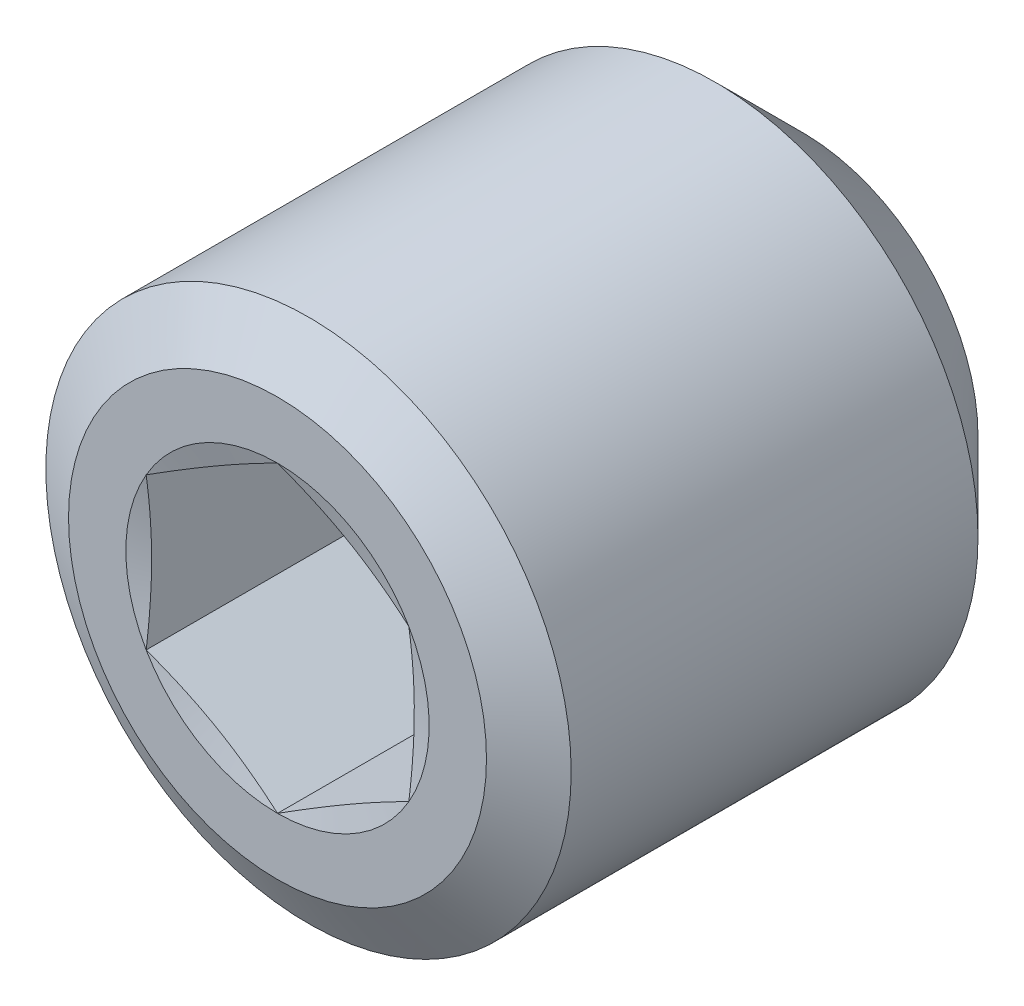
ISO-10303-21;
HEADER;
FILE_DESCRIPTION(('STEP AP214'),'2;1');
FILE_NAME('part.step','',(''),(''),'','','');
FILE_SCHEMA(('AUTOMOTIVE_DESIGN { 1 0 10303 214 1 1 1 1 }'));
ENDSEC;
DATA;
#1=APPLICATION_CONTEXT('core data for automotive mechanical design processes');
#2=APPLICATION_PROTOCOL_DEFINITION('international standard','automotive_design',2000,#1);
#3=PRODUCT_CONTEXT('',#1,'mechanical');
#4=PRODUCT('Part','Part','',(#3));
#5=PRODUCT_RELATED_PRODUCT_CATEGORY('part','',(#4));
#6=PRODUCT_DEFINITION_FORMATION('','',#4);
#7=PRODUCT_DEFINITION_CONTEXT('part definition',#1,'design');
#8=PRODUCT_DEFINITION('design','',#6,#7);
#9=PRODUCT_DEFINITION_SHAPE('','',#8);
#10=(LENGTH_UNIT() NAMED_UNIT(*) SI_UNIT(.MILLI.,.METRE.));
#11=(NAMED_UNIT(*) PLANE_ANGLE_UNIT() SI_UNIT($,.RADIAN.));
#12=(NAMED_UNIT(*) SI_UNIT($,.STERADIAN.) SOLID_ANGLE_UNIT());
#13=UNCERTAINTY_MEASURE_WITH_UNIT(LENGTH_MEASURE(1.E-05),#10,'distance_accuracy_value','');
#14=(GEOMETRIC_REPRESENTATION_CONTEXT(3) GLOBAL_UNCERTAINTY_ASSIGNED_CONTEXT((#13)) GLOBAL_UNIT_ASSIGNED_CONTEXT((#10,
#11,#12)) REPRESENTATION_CONTEXT('',''));
#15=CARTESIAN_POINT('',(0.,0.,0.));
#16=DIRECTION('',(0.,0.,1.));
#17=DIRECTION('',(1.,0.,0.));
#18=AXIS2_PLACEMENT_3D('',#15,#16,#17);
#19=CARTESIAN_POINT('',(0.,0.75,0.));
#20=DIRECTION('',(0.,0.,-1.));
#21=DIRECTION('',(-1.,0.,0.));
#22=AXIS2_PLACEMENT_3D('',#19,#20,#21);
#23=PLANE('',#22);
#24=CARTESIAN_POINT('',(0.,0.,0.));
#25=DIRECTION('',(0.,0.,1.));
#26=DIRECTION('',(1.,0.,0.));
#27=AXIS2_PLACEMENT_3D('',#24,#25,#26);
#28=CIRCLE('',#27,0.866025403784439);
#29=CARTESIAN_POINT('',(-0.75,-0.43301270189222,0.));
#30=VERTEX_POINT('',#29);
#31=CARTESIAN_POINT('',(0.,-0.866025403784439,0.));
#32=VERTEX_POINT('',#31);
#33=EDGE_CURVE('E168',#30,#32,#28,.T.);
#34=ORIENTED_EDGE('',*,*,#33,.F.);
#35=CARTESIAN_POINT('',(-0.75,0.433012701892219,0.));
#36=VERTEX_POINT('',#35);
#37=EDGE_CURVE('E167',#36,#30,#28,.T.);
#38=ORIENTED_EDGE('',*,*,#37,.F.);
#39=CARTESIAN_POINT('',(0.,0.866025403784439,0.));
#40=VERTEX_POINT('',#39);
#41=EDGE_CURVE('E133',#40,#36,#28,.T.);
#42=ORIENTED_EDGE('',*,*,#41,.F.);
#43=CARTESIAN_POINT('',(0.75,0.433012701892221,0.));
#44=VERTEX_POINT('',#43);
#45=EDGE_CURVE('E127',#44,#40,#28,.T.);
#46=ORIENTED_EDGE('',*,*,#45,.F.);
#47=CARTESIAN_POINT('',(0.75,-0.43301270189222,0.));
#48=VERTEX_POINT('',#47);
#49=EDGE_CURVE('E135',#48,#44,#28,.T.);
#50=ORIENTED_EDGE('',*,*,#49,.F.);
#51=EDGE_CURVE('E352',#32,#48,#28,.T.);
#52=ORIENTED_EDGE('',*,*,#51,.F.);
#53=EDGE_LOOP('',(#34,#38,#42,#46,#50,#52));
#54=FACE_BOUND('',#53,.T.);
#55=CARTESIAN_POINT('',(0.,0.,0.));
#56=DIRECTION('',(0.,0.,1.));
#57=DIRECTION('',(1.,0.,0.));
#58=AXIS2_PLACEMENT_3D('',#55,#56,#57);
#59=CIRCLE('',#58,1.1933);
#60=CARTESIAN_POINT('',(1.1933,0.,0.));
#61=VERTEX_POINT('',#60);
#62=EDGE_CURVE('E63',#61,#61,#59,.T.);
#63=ORIENTED_EDGE('',*,*,#62,.T.);
#64=EDGE_LOOP('',(#63));
#65=FACE_BOUND('',#64,.T.);
#66=ADVANCED_FACE('F50',(#54,#65),#23,.F.);
#67=CARTESIAN_POINT('',(0.,0.,-0.177073327560457));
#68=DIRECTION('',(0.,0.,-1.));
#69=DIRECTION('',(-1.,0.,0.));
#70=AXIS2_PLACEMENT_3D('',#67,#68,#69);
#71=CONICAL_SURFACE('',#70,1.5,1.0471975511966);
#72=ORIENTED_EDGE('',*,*,#62,.F.);
#73=EDGE_LOOP('',(#72));
#74=FACE_BOUND('',#73,.T.);
#75=CARTESIAN_POINT('',(0.,0.,-0.177073327560457));
#76=DIRECTION('',(0.,0.,1.));
#77=DIRECTION('',(1.,0.,0.));
#78=AXIS2_PLACEMENT_3D('',#75,#76,#77);
#79=CIRCLE('',#78,1.5);
#80=CARTESIAN_POINT('',(1.5,0.,-0.177073327560457));
#81=VERTEX_POINT('',#80);
#82=EDGE_CURVE('E316',#81,#81,#79,.T.);
#83=ORIENTED_EDGE('',*,*,#82,.T.);
#84=EDGE_LOOP('',(#83));
#85=FACE_BOUND('',#84,.T.);
#86=ADVANCED_FACE('F232',(#74,#85),#71,.T.);
#87=CARTESIAN_POINT('',(0.,0.,0.));
#88=DIRECTION('',(0.,0.,1.));
#89=DIRECTION('',(1.,0.,0.));
#90=AXIS2_PLACEMENT_3D('',#87,#88,#89);
#91=CYLINDRICAL_SURFACE('',#90,1.5);
#92=ORIENTED_EDGE('',*,*,#82,.F.);
#93=EDGE_LOOP('',(#92));
#94=FACE_BOUND('',#93,.T.);
#95=CARTESIAN_POINT('',(0.,0.,-2.5));
#96=DIRECTION('',(0.,0.,1.));
#97=DIRECTION('',(1.,0.,0.));
#98=AXIS2_PLACEMENT_3D('',#95,#96,#97);
#99=CIRCLE('',#98,1.5);
#100=CARTESIAN_POINT('',(1.5,0.,-2.5));
#101=VERTEX_POINT('',#100);
#102=EDGE_CURVE('E313',#101,#101,#99,.T.);
#103=ORIENTED_EDGE('',*,*,#102,.T.);
#104=EDGE_LOOP('',(#103));
#105=FACE_BOUND('',#104,.T.);
#106=ADVANCED_FACE('F236',(#94,#105),#91,.T.);
#107=CARTESIAN_POINT('',(0.,0.,-3.));
#108=DIRECTION('',(0.,0.,1.));
#109=DIRECTION('',(1.,0.,0.));
#110=AXIS2_PLACEMENT_3D('',#107,#108,#109);
#111=CONICAL_SURFACE('',#110,1.,0.78539816339745);
#112=ORIENTED_EDGE('',*,*,#102,.F.);
#113=EDGE_LOOP('',(#112));
#114=FACE_BOUND('',#113,.T.);
#115=CARTESIAN_POINT('',(0.,0.,-3.));
#116=DIRECTION('',(0.,0.,1.));
#117=DIRECTION('',(1.,0.,0.));
#118=AXIS2_PLACEMENT_3D('',#115,#116,#117);
#119=CIRCLE('',#118,1.);
#120=CARTESIAN_POINT('',(1.,0.,-3.));
#121=VERTEX_POINT('',#120);
#122=EDGE_CURVE('E308',#121,#121,#119,.T.);
#123=ORIENTED_EDGE('',*,*,#122,.T.);
#124=EDGE_LOOP('',(#123));
#125=FACE_BOUND('',#124,.T.);
#126=ADVANCED_FACE('F241',(#114,#125),#111,.T.);
#127=CARTESIAN_POINT('',(0.,1.,-3.));
#128=DIRECTION('',(0.,0.,1.));
#129=DIRECTION('',(1.,0.,0.));
#130=AXIS2_PLACEMENT_3D('',#127,#128,#129);
#131=PLANE('',#130);
#132=ORIENTED_EDGE('',*,*,#122,.F.);
#133=EDGE_LOOP('',(#132));
#134=FACE_BOUND('',#133,.T.);
#135=ADVANCED_FACE('F249',(#134),#131,.F.);
#136=CARTESIAN_POINT('',(0.,0.,-0.0310889132455345));
#137=DIRECTION('',(0.,0.,1.));
#138=DIRECTION('',(1.,0.,0.));
#139=AXIS2_PLACEMENT_3D('',#136,#137,#138);
#140=CONICAL_SURFACE('',#139,0.75,1.30899693899575);
#141=ORIENTED_EDGE('',*,*,#41,.T.);
#142=CARTESIAN_POINT('',(-0.7502,0.432897231838382,3.09462948722955E-05));
#143=CARTESIAN_POINT('',(-0.719037840271989,0.450888713145879,-0.00479360311149052));
#144=CARTESIAN_POINT('',(-0.687819151238554,0.46891283166308,-0.00917362250903638));
#145=CARTESIAN_POINT('',(-0.625271438524168,0.505024770435926,-0.0168690566741957));
#146=CARTESIAN_POINT('',(-0.593942375178671,0.523112613591908,-0.0201840383063054));
#147=CARTESIAN_POINT('',(-0.53136401188606,0.559242248484343,-0.0255557361470388));
#148=CARTESIAN_POINT('',(-0.5001151357921,0.577283795509064,-0.0276188631563584));
#149=CARTESIAN_POINT('',(-0.437577500528089,0.613389916063223,-0.0303853199406949));
#150=CARTESIAN_POINT('',(-0.406288750264044,0.631454484450776,-0.0310889132455345));
#151=CARTESIAN_POINT('',(-0.343711249735955,0.667583621225882,-0.0310889132455345));
#152=CARTESIAN_POINT('',(-0.312422499471911,0.685648189613435,-0.0303853199406949));
#153=CARTESIAN_POINT('',(-0.2498848642079,0.721754310167595,-0.0276188631563584));
#154=CARTESIAN_POINT('',(-0.21863598811394,0.739795857192316,-0.0255557361470388));
#155=CARTESIAN_POINT('',(-0.156057624821329,0.775925492084751,-0.0201840383063053));
#156=CARTESIAN_POINT('',(-0.124728561475832,0.794013335240732,-0.0168690566741957));
#157=CARTESIAN_POINT('',(-0.0621808487614456,0.830125274013579,-0.00917362250903635));
#158=CARTESIAN_POINT('',(-0.0309621597280111,0.84814939253078,-0.00479360311149048));
#159=CARTESIAN_POINT('',(0.000200000000000067,0.866140873838277,3.09462948723408E-05));
#160=B_SPLINE_CURVE_WITH_KNOTS('',3,(#142,#143,#144,#145,#146,#147,#148,#149,#150,#151,#152,
#153,#154,#155,#156,#157,#158,#159),.UNSPECIFIED.,.F.,.F.,(4,2,2,2,2,2,2,2,4),(0.,
0.108920587259312,0.217885415043552,0.326287413293608,0.434668396966266,0.543049380638924,
0.651451378888981,0.760416206673221,0.869336793932533),.UNSPECIFIED.);
#161=EDGE_CURVE('E13',#36,#40,#160,.T.);
#162=ORIENTED_EDGE('',*,*,#161,.T.);
#163=EDGE_LOOP('',(#141,#162));
#164=FACE_BOUND('',#163,.T.);
#165=ADVANCED_FACE('F139',(#164),#140,.F.);
#166=CARTESIAN_POINT('',(-0.75,-1.14482258623613,0.134669625246679));
#167=CARTESIAN_POINT('',(-0.75,-1.07678185164575,0.119460916934509));
#168=CARTESIAN_POINT('',(-0.75,-1.00866186993933,0.104564139677018));
#169=CARTESIAN_POINT('',(-0.75,-0.872108780270126,0.0759343556155119));
#170=CARTESIAN_POINT('',(-0.75,-0.803675428468903,0.0622025196192104));
#171=CARTESIAN_POINT('',(-0.75,-0.667024328389677,0.036577806672853));
#172=CARTESIAN_POINT('',(-0.75,-0.598809231475783,0.0246711034130509));
#173=CARTESIAN_POINT('',(-0.75,-0.461968565078348,0.00349957725576412));
#174=CARTESIAN_POINT('',(-0.75,-0.39334306917455,-0.0057657055287068));
#175=CARTESIAN_POINT('',(-0.75,-0.254874387193196,-0.0204880637590049));
#176=CARTESIAN_POINT('',(-0.75,-0.185026204144042,-0.0259009217168572));
#177=CARTESIAN_POINT('',(-0.75,-0.0451386456006471,-0.031572823328204));
#178=CARTESIAN_POINT('',(-0.75,0.0249006157145767,-0.0318344646143008));
#179=CARTESIAN_POINT('',(-0.75,0.165046593870639,-0.0271336726580644));
#180=CARTESIAN_POINT('',(-0.75,0.235152611190908,-0.0221520199445758));
#181=CARTESIAN_POINT('',(-0.75,0.374971381665316,-0.0080496439068817));
#182=CARTESIAN_POINT('',(-0.75,0.444683810838038,0.00107409444110468));
#183=CARTESIAN_POINT('',(-0.75,0.57900664470664,0.0214252947723858));
#184=CARTESIAN_POINT('',(-0.75,0.643645711070564,0.0324706666633663));
#185=CARTESIAN_POINT('',(-0.75,0.772626203639038,0.0561976243366958));
#186=CARTESIAN_POINT('',(-0.75,0.836967591207446,0.0688794166647535));
#187=CARTESIAN_POINT('',(-0.75,0.96543538187879,0.0953387697110075));
#188=CARTESIAN_POINT('',(-0.75,1.02956173962238,0.109116548118427));
#189=CARTESIAN_POINT('',(-0.75,1.15764916486959,0.137422879220211));
#190=CARTESIAN_POINT('',(-0.75,1.22161022807931,0.151951451216337));
#191=CARTESIAN_POINT('',(-0.75,1.41205284321498,0.196019971996214));
#192=CARTESIAN_POINT('',(-0.75,1.53835925197156,0.226314183405895));
#193=CARTESIAN_POINT('',(-0.75,1.72754301618681,0.272539035787116));
#194=CARTESIAN_POINT('',(-0.75,1.79052001268668,0.28806821024875));
#195=CARTESIAN_POINT('',(-0.75,1.91641912521064,0.319338785610066));
#196=CARTESIAN_POINT('',(-0.75,1.97934124297332,0.335080179505711));
#197=CARTESIAN_POINT('',(-0.75,2.04224365999308,0.350900921516615));
#198=B_SPLINE_CURVE_WITH_KNOTS('',3,(#166,#167,#168,#169,#170,#171,#172,#173,#174,#175,#176,
#177,#178,#179,#180,#181,#182,#183,#184,#185,#186,#187,#188,#189,#190,#191,#192,#193,#194,#195,
#196,#197),.UNSPECIFIED.,.F.,.F.,(4,2,2,2,2,2,2,2,2,2,2,2,2,2,2,4),(0.,0.209172832960231,
0.418553461255022,0.626259888239563,0.833930130186138,1.04394713172849,1.2538582241185,
1.46454144122955,1.67537826112991,1.87207734374703,2.06880127765738,2.26556438371338,
2.46233255076827,2.85198678875997,3.04657695287832,3.24116071043612),.UNSPECIFIED.);
#199=EDGE_CURVE('E132',#30,#36,#198,.T.);
#200=ORIENTED_EDGE('',*,*,#199,.T.);
#201=ORIENTED_EDGE('',*,*,#37,.T.);
#202=EDGE_LOOP('',(#200,#201));
#203=FACE_BOUND('',#202,.T.);
#204=ADVANCED_FACE('F365',(#203),#140,.F.);
#205=CARTESIAN_POINT('',(0.000199999999999855,-0.866140873838277,3.09462948723064E-05));
#206=CARTESIAN_POINT('',(-0.0309621597280113,-0.848149392530779,-0.00479360311149048));
#207=CARTESIAN_POINT('',(-0.0621808487614458,-0.830125274013579,-0.00917362250903636));
#208=CARTESIAN_POINT('',(-0.124728561475833,-0.794013335240732,-0.0168690566741957));
#209=CARTESIAN_POINT('',(-0.15605762482133,-0.775925492084751,-0.0201840383063054));
#210=CARTESIAN_POINT('',(-0.218635988113941,-0.739795857192315,-0.0255557361470388));
#211=CARTESIAN_POINT('',(-0.2498848642079,-0.721754310167595,-0.0276188631563584));
#212=CARTESIAN_POINT('',(-0.312422499471911,-0.685648189613435,-0.0303853199406949));
#213=CARTESIAN_POINT('',(-0.343711249735956,-0.667583621225882,-0.0310889132455345));
#214=CARTESIAN_POINT('',(-0.406288750264045,-0.631454484450776,-0.0310889132455345));
#215=CARTESIAN_POINT('',(-0.437577500528089,-0.613389916063223,-0.0303853199406949));
#216=CARTESIAN_POINT('',(-0.5001151357921,-0.577283795509064,-0.0276188631563584));
#217=CARTESIAN_POINT('',(-0.53136401188606,-0.559242248484343,-0.0255557361470388));
#218=CARTESIAN_POINT('',(-0.593942375178671,-0.523112613591908,-0.0201840383063054));
#219=CARTESIAN_POINT('',(-0.625271438524167,-0.505024770435926,-0.0168690566741957));
#220=CARTESIAN_POINT('',(-0.687819151238554,-0.468912831663079,-0.0091736225090364));
#221=CARTESIAN_POINT('',(-0.719037840271989,-0.450888713145879,-0.00479360311149054));
#222=CARTESIAN_POINT('',(-0.7502,-0.432897231838381,3.09462948722653E-05));
#223=B_SPLINE_CURVE_WITH_KNOTS('',3,(#205,#206,#207,#208,#209,#210,#211,#212,#213,#214,#215,
#216,#217,#218,#219,#220,#221,#222),.UNSPECIFIED.,.F.,.F.,(4,2,2,2,2,2,2,2,4),(0.,
0.108920587259312,0.217885415043551,0.326287413293608,0.434668396966266,0.543049380638924,
0.651451378888981,0.760416206673221,0.869336793932533),.UNSPECIFIED.);
#224=EDGE_CURVE('E176',#32,#30,#223,.T.);
#225=ORIENTED_EDGE('',*,*,#224,.T.);
#226=ORIENTED_EDGE('',*,*,#33,.T.);
#227=EDGE_LOOP('',(#225,#226));
#228=FACE_BOUND('',#227,.T.);
#229=ADVANCED_FACE('F356',(#228),#140,.F.);
#230=CARTESIAN_POINT('',(0.7502,-0.432897231838382,3.09462948722924E-05));
#231=CARTESIAN_POINT('',(0.719037840271989,-0.450888713145879,-0.0047936031114905));
#232=CARTESIAN_POINT('',(0.687819151238554,-0.46891283166308,-0.00917362250903637));
#233=CARTESIAN_POINT('',(0.625271438524167,-0.505024770435927,-0.0168690566741957));
#234=CARTESIAN_POINT('',(0.59394237517867,-0.523112613591908,-0.0201840383063053));
#235=CARTESIAN_POINT('',(0.531364011886059,-0.559242248484343,-0.0255557361470388));
#236=CARTESIAN_POINT('',(0.5001151357921,-0.577283795509064,-0.0276188631563584));
#237=CARTESIAN_POINT('',(0.437577500528089,-0.613389916063223,-0.0303853199406949));
#238=CARTESIAN_POINT('',(0.406288750264044,-0.631454484450776,-0.0310889132455344));
#239=CARTESIAN_POINT('',(0.343711249735955,-0.667583621225883,-0.0310889132455344));
#240=CARTESIAN_POINT('',(0.312422499471911,-0.685648189613436,-0.0303853199406949));
#241=CARTESIAN_POINT('',(0.2498848642079,-0.721754310167595,-0.0276188631563584));
#242=CARTESIAN_POINT('',(0.21863598811394,-0.739795857192316,-0.0255557361470388));
#243=CARTESIAN_POINT('',(0.156057624821329,-0.775925492084751,-0.0201840383063053));
#244=CARTESIAN_POINT('',(0.124728561475832,-0.794013335240732,-0.0168690566741957));
#245=CARTESIAN_POINT('',(0.0621808487614454,-0.830125274013579,-0.00917362250903631));
#246=CARTESIAN_POINT('',(0.0309621597280108,-0.84814939253078,-0.00479360311149044));
#247=CARTESIAN_POINT('',(-0.00020000000000023,-0.866140873838277,3.09462948723442E-05));
#248=B_SPLINE_CURVE_WITH_KNOTS('',3,(#230,#231,#232,#233,#234,#235,#236,#237,#238,#239,#240,
#241,#242,#243,#244,#245,#246,#247),.UNSPECIFIED.,.F.,.F.,(4,2,2,2,2,2,2,2,4),(0.,
0.108920587259311,0.217885415043551,0.326287413293608,0.434668396966266,0.543049380638924,
0.651451378888981,0.760416206673221,0.869336793932532),.UNSPECIFIED.);
#249=EDGE_CURVE('E197',#48,#32,#248,.T.);
#250=ORIENTED_EDGE('',*,*,#249,.T.);
#251=ORIENTED_EDGE('',*,*,#51,.T.);
#252=EDGE_LOOP('',(#250,#251));
#253=FACE_BOUND('',#252,.T.);
#254=ADVANCED_FACE('F359',(#253),#140,.F.);
#255=CARTESIAN_POINT('',(0.75,-1.14482266306326,0.134669642466261));
#256=CARTESIAN_POINT('',(0.75,-1.0767819222614,0.119460932464624));
#257=CARTESIAN_POINT('',(0.75,-1.00866193434151,0.104564153515208));
#258=CARTESIAN_POINT('',(0.75,-0.872108832201385,0.0759343661472826));
#259=CARTESIAN_POINT('',(0.75,-0.803675474142626,0.062202528536825));
#260=CARTESIAN_POINT('',(0.75,-0.66702436167103,0.0365778125664734));
#261=CARTESIAN_POINT('',(0.75,-0.59880925862319,0.0246711078925944));
#262=CARTESIAN_POINT('',(0.75,-0.461968579892892,0.00349957926823649));
#263=CARTESIAN_POINT('',(0.75,-0.393343077790215,-0.00576570456945883));
#264=CARTESIAN_POINT('',(0.75,-0.254874382659345,-0.0204880642843832));
#265=CARTESIAN_POINT('',(0.75,-0.185026192654729,-0.0259009226317642));
#266=CARTESIAN_POINT('',(0.75,-0.0451386201937041,-0.031572823912739));
#267=CARTESIAN_POINT('',(0.75,0.0249006480836576,-0.0318344644799666));
#268=CARTESIAN_POINT('',(0.75,0.165046640103213,-0.0271336701465318));
#269=CARTESIAN_POINT('',(0.75,0.235152664324342,-0.022152015769204));
#270=CARTESIAN_POINT('',(0.75,0.374971448497296,-0.00804963597099166));
#271=CARTESIAN_POINT('',(0.75,0.444683884467515,0.00107410447489512));
#272=CARTESIAN_POINT('',(0.75,0.579006724953306,0.0214253079772582));
#273=CARTESIAN_POINT('',(0.749999999999999,0.643645791179342,0.0324706806913168));
#274=CARTESIAN_POINT('',(0.749999999999999,0.772626283503578,0.0561976397363368));
#275=CARTESIAN_POINT('',(0.749999999999999,0.836967670965656,0.068879432612883));
#276=CARTESIAN_POINT('',(0.749999999999999,0.965435461427999,0.0953387865733186));
#277=CARTESIAN_POINT('',(0.749999999999999,1.02956181906901,0.109116565345963));
#278=CARTESIAN_POINT('',(0.749999999999999,1.15764924413234,0.137422897063653));
#279=CARTESIAN_POINT('',(0.749999999999999,1.22161030726075,0.151951469310449));
#280=CARTESIAN_POINT('',(0.749999999999999,1.41205292198059,0.196019990684347));
#281=CARTESIAN_POINT('',(0.749999999999999,1.5383593304253,0.226314202328641));
#282=CARTESIAN_POINT('',(0.749999999999999,1.72754309424218,0.272539054977161));
#283=CARTESIAN_POINT('',(0.749999999999999,1.79052009064412,0.288068229519657));
#284=CARTESIAN_POINT('',(0.749999999999999,1.91641920297853,0.319338805018936));
#285=CARTESIAN_POINT('',(0.749999999999999,1.97934132064959,0.335080198971683));
#286=CARTESIAN_POINT('',(0.749999999999999,2.04224373757961,0.35090094103151));
#287=B_SPLINE_CURVE_WITH_KNOTS('',3,(#255,#256,#257,#258,#259,#260,#261,#262,#263,#264,#265,
#266,#267,#268,#269,#270,#271,#272,#273,#274,#275,#276,#277,#278,#279,#280,#281,#282,#283,#284,
#285,#286),.UNSPECIFIED.,.F.,.F.,(4,2,2,2,2,2,2,2,2,2,2,2,2,2,2,4),(0.,0.209172852253365,
0.41855349990594,0.626259945743289,0.833930206526213,1.04394722891203,1.25385834211573,
1.46454158019992,1.67537842113495,1.87207750377204,2.06880143769159,2.26556454367898,
2.46233271066339,2.85198694791251,3.04657711180368,3.24116086913639),.UNSPECIFIED.);
#288=EDGE_CURVE('E75',#44,#48,#287,.F.);
#289=ORIENTED_EDGE('',*,*,#288,.T.);
#290=ORIENTED_EDGE('',*,*,#49,.T.);
#291=EDGE_LOOP('',(#289,#290));
#292=FACE_BOUND('',#291,.T.);
#293=ADVANCED_FACE('F189',(#292),#140,.F.);
#294=CARTESIAN_POINT('',(-0.000199999999999987,0.866140873838277,3.09462948723615E-05));
#295=CARTESIAN_POINT('',(0.0309621597280111,0.84814939253078,-0.00479360311149045));
#296=CARTESIAN_POINT('',(0.0621808487614456,0.830125274013579,-0.00917362250903632));
#297=CARTESIAN_POINT('',(0.124728561475833,0.794013335240732,-0.0168690566741957));
#298=CARTESIAN_POINT('',(0.156057624821329,0.775925492084751,-0.0201840383063053));
#299=CARTESIAN_POINT('',(0.21863598811394,0.739795857192316,-0.0255557361470388));
#300=CARTESIAN_POINT('',(0.2498848642079,0.721754310167595,-0.0276188631563584));
#301=CARTESIAN_POINT('',(0.312422499471911,0.685648189613436,-0.0303853199406949));
#302=CARTESIAN_POINT('',(0.343711249735955,0.667583621225883,-0.0310889132455345));
#303=CARTESIAN_POINT('',(0.406288750264044,0.631454484450776,-0.0310889132455344));
#304=CARTESIAN_POINT('',(0.437577500528089,0.613389916063223,-0.0303853199406949));
#305=CARTESIAN_POINT('',(0.5001151357921,0.577283795509064,-0.0276188631563584));
#306=CARTESIAN_POINT('',(0.531364011886059,0.559242248484343,-0.0255557361470388));
#307=CARTESIAN_POINT('',(0.59394237517867,0.523112613591908,-0.0201840383063054));
#308=CARTESIAN_POINT('',(0.625271438524167,0.505024770435927,-0.0168690566741957));
#309=CARTESIAN_POINT('',(0.687819151238554,0.46891283166308,-0.00917362250903637));
#310=CARTESIAN_POINT('',(0.719037840271989,0.450888713145879,-0.0047936031114905));
#311=CARTESIAN_POINT('',(0.7502,0.432897231838382,3.09462948722619E-05));
#312=B_SPLINE_CURVE_WITH_KNOTS('',3,(#294,#295,#296,#297,#298,#299,#300,#301,#302,#303,#304,
#305,#306,#307,#308,#309,#310,#311),.UNSPECIFIED.,.F.,.F.,(4,2,2,2,2,2,2,2,4),(0.,
0.108920587259311,0.217885415043551,0.326287413293608,0.434668396966266,0.543049380638924,
0.651451378888981,0.760416206673221,0.869336793932532),.UNSPECIFIED.);
#313=EDGE_CURVE('E69',#40,#44,#312,.T.);
#314=ORIENTED_EDGE('',*,*,#313,.T.);
#315=ORIENTED_EDGE('',*,*,#45,.T.);
#316=EDGE_LOOP('',(#314,#315));
#317=FACE_BOUND('',#316,.T.);
#318=ADVANCED_FACE('F128',(#317),#140,.F.);
#319=CARTESIAN_POINT('',(0.,0.,-1.2));
#320=DIRECTION('',(0.,0.,1.));
#321=DIRECTION('',(1.,0.,0.));
#322=AXIS2_PLACEMENT_3D('',#319,#320,#321);
#323=CONICAL_SURFACE('',#322,0.75,1.0471975511966);
#324=CARTESIAN_POINT('',(0.,0.,-1.63301270189222));
#325=VERTEX_POINT('',#324);
#326=VERTEX_LOOP('',#325);
#327=FACE_BOUND('',#326,.T.);
#328=CARTESIAN_POINT('',(0.,0.,-1.2));
#329=DIRECTION('',(0.,0.,1.));
#330=DIRECTION('',(1.,0.,0.));
#331=AXIS2_PLACEMENT_3D('',#328,#329,#330);
#332=CIRCLE('',#331,0.75);
#333=CARTESIAN_POINT('',(0.75,0.,-1.2));
#334=VERTEX_POINT('',#333);
#335=CARTESIAN_POINT('',(0.375,0.649519052838329,-1.2));
#336=VERTEX_POINT('',#335);
#337=EDGE_CURVE('E306',#334,#336,#332,.T.);
#338=ORIENTED_EDGE('',*,*,#337,.T.);
#339=CARTESIAN_POINT('',(-0.375,0.649519052838329,-1.2));
#340=VERTEX_POINT('',#339);
#341=EDGE_CURVE('E305',#336,#340,#332,.T.);
#342=ORIENTED_EDGE('',*,*,#341,.T.);
#343=CARTESIAN_POINT('',(-0.75,0.,-1.2));
#344=VERTEX_POINT('',#343);
#345=EDGE_CURVE('E290',#340,#344,#332,.T.);
#346=ORIENTED_EDGE('',*,*,#345,.T.);
#347=CARTESIAN_POINT('',(-0.375,-0.649519052838329,-1.2));
#348=VERTEX_POINT('',#347);
#349=EDGE_CURVE('E281',#344,#348,#332,.T.);
#350=ORIENTED_EDGE('',*,*,#349,.T.);
#351=CARTESIAN_POINT('',(0.375,-0.649519052838329,-1.2));
#352=VERTEX_POINT('',#351);
#353=EDGE_CURVE('E291',#348,#352,#332,.T.);
#354=ORIENTED_EDGE('',*,*,#353,.T.);
#355=EDGE_CURVE('E309',#352,#334,#332,.T.);
#356=ORIENTED_EDGE('',*,*,#355,.T.);
#357=EDGE_LOOP('',(#338,#342,#346,#350,#354,#356));
#358=FACE_BOUND('',#357,.T.);
#359=ADVANCED_FACE('F188',(#327,#358),#323,.F.);
#360=CARTESIAN_POINT('',(0.,0.,-1.2));
#361=DIRECTION('',(0.,0.,1.));
#362=DIRECTION('',(1.,0.,0.));
#363=AXIS2_PLACEMENT_3D('',#360,#361,#362);
#364=PLANE('',#363);
#365=ORIENTED_EDGE('',*,*,#337,.F.);
#366=DIRECTION('',(0.,1.,0.));
#367=VECTOR('',#366,1.);
#368=CARTESIAN_POINT('',(0.75,-0.43301270189222,-1.2));
#369=LINE('',#368,#367);
#370=CARTESIAN_POINT('',(0.75,0.43301270189222,-1.2));
#371=VERTEX_POINT('',#370);
#372=EDGE_CURVE('E335',#334,#371,#369,.T.);
#373=ORIENTED_EDGE('',*,*,#372,.T.);
#374=DIRECTION('',(-0.866025403784439,0.5,0.));
#375=VECTOR('',#374,1.);
#376=CARTESIAN_POINT('',(0.75,0.43301270189222,-1.2));
#377=LINE('',#376,#375);
#378=EDGE_CURVE('E341',#371,#336,#377,.T.);
#379=ORIENTED_EDGE('',*,*,#378,.T.);
#380=EDGE_LOOP('',(#365,#373,#379));
#381=FACE_BOUND('',#380,.T.);
#382=ADVANCED_FACE('F255',(#381),#364,.T.);
#383=ORIENTED_EDGE('',*,*,#355,.F.);
#384=DIRECTION('',(0.866025403784439,0.5,0.));
#385=VECTOR('',#384,1.);
#386=CARTESIAN_POINT('',(0.,-0.866025403784439,-1.2));
#387=LINE('',#386,#385);
#388=CARTESIAN_POINT('',(0.75,-0.43301270189222,-1.2));
#389=VERTEX_POINT('',#388);
#390=EDGE_CURVE('E339',#352,#389,#387,.T.);
#391=ORIENTED_EDGE('',*,*,#390,.T.);
#392=EDGE_CURVE('E162',#389,#334,#369,.T.);
#393=ORIENTED_EDGE('',*,*,#392,.T.);
#394=EDGE_LOOP('',(#383,#391,#393));
#395=FACE_BOUND('',#394,.T.);
#396=ADVANCED_FACE('F190',(#395),#364,.T.);
#397=ORIENTED_EDGE('',*,*,#353,.F.);
#398=DIRECTION('',(0.866025403784438,-0.5,0.));
#399=VECTOR('',#398,1.);
#400=CARTESIAN_POINT('',(-0.75,-0.433012701892219,-1.2));
#401=LINE('',#400,#399);
#402=CARTESIAN_POINT('',(0.,-0.866025403784439,-1.2));
#403=VERTEX_POINT('',#402);
#404=EDGE_CURVE('E301',#348,#403,#401,.T.);
#405=ORIENTED_EDGE('',*,*,#404,.T.);
#406=EDGE_CURVE('E336',#403,#352,#387,.T.);
#407=ORIENTED_EDGE('',*,*,#406,.T.);
#408=EDGE_LOOP('',(#397,#405,#407));
#409=FACE_BOUND('',#408,.T.);
#410=ADVANCED_FACE('F273',(#409),#364,.T.);
#411=ORIENTED_EDGE('',*,*,#349,.F.);
#412=DIRECTION('',(0.,-1.,0.));
#413=VECTOR('',#412,1.);
#414=CARTESIAN_POINT('',(-0.75,0.433012701892219,-1.2));
#415=LINE('',#414,#413);
#416=CARTESIAN_POINT('',(-0.75,-0.433012701892219,-1.2));
#417=VERTEX_POINT('',#416);
#418=EDGE_CURVE('E283',#344,#417,#415,.T.);
#419=ORIENTED_EDGE('',*,*,#418,.T.);
#420=EDGE_CURVE('E286',#417,#348,#401,.T.);
#421=ORIENTED_EDGE('',*,*,#420,.T.);
#422=EDGE_LOOP('',(#411,#419,#421));
#423=FACE_BOUND('',#422,.T.);
#424=ADVANCED_FACE('F267',(#423),#364,.T.);
#425=ORIENTED_EDGE('',*,*,#341,.F.);
#426=CARTESIAN_POINT('',(0.,0.866025403784439,-1.2));
#427=VERTEX_POINT('',#426);
#428=EDGE_CURVE('E155',#336,#427,#377,.T.);
#429=ORIENTED_EDGE('',*,*,#428,.T.);
#430=DIRECTION('',(-0.866025403784439,-0.5,0.));
#431=VECTOR('',#430,1.);
#432=CARTESIAN_POINT('',(0.,0.866025403784439,-1.2));
#433=LINE('',#432,#431);
#434=EDGE_CURVE('E160',#427,#340,#433,.T.);
#435=ORIENTED_EDGE('',*,*,#434,.T.);
#436=EDGE_LOOP('',(#425,#429,#435));
#437=FACE_BOUND('',#436,.T.);
#438=ADVANCED_FACE('F265',(#437),#364,.T.);
#439=ORIENTED_EDGE('',*,*,#345,.F.);
#440=CARTESIAN_POINT('',(-0.75,0.433012701892219,-1.2));
#441=VERTEX_POINT('',#440);
#442=EDGE_CURVE('E300',#340,#441,#433,.T.);
#443=ORIENTED_EDGE('',*,*,#442,.T.);
#444=EDGE_CURVE('E296',#441,#344,#415,.T.);
#445=ORIENTED_EDGE('',*,*,#444,.T.);
#446=EDGE_LOOP('',(#439,#443,#445));
#447=FACE_BOUND('',#446,.T.);
#448=ADVANCED_FACE('F261',(#447),#364,.T.);
#449=CARTESIAN_POINT('',(0.,0.866025403784439,-1.2));
#450=DIRECTION('',(-0.5,0.866025403784439,0.));
#451=DIRECTION('',(-0.866025403784439,-0.5,0.));
#452=AXIS2_PLACEMENT_3D('',#449,#450,#451);
#453=PLANE('',#452);
#454=ORIENTED_EDGE('',*,*,#161,.F.);
#455=DIRECTION('',(0.,0.,1.));
#456=VECTOR('',#455,1.);
#457=CARTESIAN_POINT('',(-0.75,0.433012701892219,-1.2));
#458=LINE('',#457,#456);
#459=EDGE_CURVE('E161',#441,#36,#458,.T.);
#460=ORIENTED_EDGE('',*,*,#459,.F.);
#461=ORIENTED_EDGE('',*,*,#442,.F.);
#462=ORIENTED_EDGE('',*,*,#434,.F.);
#463=DIRECTION('',(0.,0.,1.));
#464=VECTOR('',#463,1.);
#465=CARTESIAN_POINT('',(0.,0.866025403784439,-1.2));
#466=LINE('',#465,#464);
#467=EDGE_CURVE('E150',#427,#40,#466,.T.);
#468=ORIENTED_EDGE('',*,*,#467,.T.);
#469=EDGE_LOOP('',(#454,#460,#461,#462,#468));
#470=FACE_BOUND('',#469,.T.);
#471=ADVANCED_FACE('F157',(#470),#453,.F.);
#472=CARTESIAN_POINT('',(-0.75,0.433012701892219,-1.2));
#473=DIRECTION('',(-1.,0.,0.));
#474=DIRECTION('',(0.,0.,1.));
#475=AXIS2_PLACEMENT_3D('',#472,#473,#474);
#476=PLANE('',#475);
#477=ORIENTED_EDGE('',*,*,#199,.F.);
#478=DIRECTION('',(0.,0.,1.));
#479=VECTOR('',#478,1.);
#480=CARTESIAN_POINT('',(-0.75,-0.433012701892219,-1.2));
#481=LINE('',#480,#479);
#482=EDGE_CURVE('E298',#417,#30,#481,.T.);
#483=ORIENTED_EDGE('',*,*,#482,.F.);
#484=ORIENTED_EDGE('',*,*,#418,.F.);
#485=ORIENTED_EDGE('',*,*,#444,.F.);
#486=ORIENTED_EDGE('',*,*,#459,.T.);
#487=EDGE_LOOP('',(#477,#483,#484,#485,#486));
#488=FACE_BOUND('',#487,.T.);
#489=ADVANCED_FACE('F183',(#488),#476,.F.);
#490=CARTESIAN_POINT('',(-0.75,-0.433012701892219,-1.2));
#491=DIRECTION('',(-0.5,-0.866025403784438,0.));
#492=DIRECTION('',(0.866025403784439,-0.5,0.));
#493=AXIS2_PLACEMENT_3D('',#490,#491,#492);
#494=PLANE('',#493);
#495=ORIENTED_EDGE('',*,*,#224,.F.);
#496=DIRECTION('',(0.,0.,1.));
#497=VECTOR('',#496,1.);
#498=CARTESIAN_POINT('',(0.,-0.866025403784439,-1.2));
#499=LINE('',#498,#497);
#500=EDGE_CURVE('E326',#403,#32,#499,.T.);
#501=ORIENTED_EDGE('',*,*,#500,.F.);
#502=ORIENTED_EDGE('',*,*,#404,.F.);
#503=ORIENTED_EDGE('',*,*,#420,.F.);
#504=ORIENTED_EDGE('',*,*,#482,.T.);
#505=EDGE_LOOP('',(#495,#501,#502,#503,#504));
#506=FACE_BOUND('',#505,.T.);
#507=ADVANCED_FACE('F221',(#506),#494,.F.);
#508=CARTESIAN_POINT('',(0.,-0.866025403784439,-1.2));
#509=DIRECTION('',(0.5,-0.866025403784439,0.));
#510=DIRECTION('',(0.866025403784439,0.5,0.));
#511=AXIS2_PLACEMENT_3D('',#508,#509,#510);
#512=PLANE('',#511);
#513=ORIENTED_EDGE('',*,*,#249,.F.);
#514=DIRECTION('',(0.,0.,1.));
#515=VECTOR('',#514,1.);
#516=CARTESIAN_POINT('',(0.75,-0.43301270189222,-1.2));
#517=LINE('',#516,#515);
#518=EDGE_CURVE('E329',#389,#48,#517,.T.);
#519=ORIENTED_EDGE('',*,*,#518,.F.);
#520=ORIENTED_EDGE('',*,*,#390,.F.);
#521=ORIENTED_EDGE('',*,*,#406,.F.);
#522=ORIENTED_EDGE('',*,*,#500,.T.);
#523=EDGE_LOOP('',(#513,#519,#520,#521,#522));
#524=FACE_BOUND('',#523,.T.);
#525=ADVANCED_FACE('F217',(#524),#512,.F.);
#526=CARTESIAN_POINT('',(0.75,-0.43301270189222,-1.2));
#527=DIRECTION('',(1.,0.,0.));
#528=DIRECTION('',(0.,1.,0.));
#529=AXIS2_PLACEMENT_3D('',#526,#527,#528);
#530=PLANE('',#529);
#531=ORIENTED_EDGE('',*,*,#288,.F.);
#532=DIRECTION('',(0.,0.,1.));
#533=VECTOR('',#532,1.);
#534=CARTESIAN_POINT('',(0.75,0.43301270189222,-1.2));
#535=LINE('',#534,#533);
#536=EDGE_CURVE('E154',#371,#44,#535,.T.);
#537=ORIENTED_EDGE('',*,*,#536,.F.);
#538=ORIENTED_EDGE('',*,*,#372,.F.);
#539=ORIENTED_EDGE('',*,*,#392,.F.);
#540=ORIENTED_EDGE('',*,*,#518,.T.);
#541=EDGE_LOOP('',(#531,#537,#538,#539,#540));
#542=FACE_BOUND('',#541,.T.);
#543=ADVANCED_FACE('F214',(#542),#530,.F.);
#544=CARTESIAN_POINT('',(0.75,0.43301270189222,-1.2));
#545=DIRECTION('',(0.5,0.866025403784439,0.));
#546=DIRECTION('',(-0.866025403784439,0.5,0.));
#547=AXIS2_PLACEMENT_3D('',#544,#545,#546);
#548=PLANE('',#547);
#549=ORIENTED_EDGE('',*,*,#313,.F.);
#550=ORIENTED_EDGE('',*,*,#467,.F.);
#551=ORIENTED_EDGE('',*,*,#428,.F.);
#552=ORIENTED_EDGE('',*,*,#378,.F.);
#553=ORIENTED_EDGE('',*,*,#536,.T.);
#554=EDGE_LOOP('',(#549,#550,#551,#552,#553));
#555=FACE_BOUND('',#554,.T.);
#556=ADVANCED_FACE('F148',(#555),#548,.F.);
#557=CLOSED_SHELL('',(#66,#86,#106,#126,#135,#165,#204,#229,#254,#293,#318,#359,#382,#396,#410,
#424,#438,#448,#471,#489,#507,#525,#543,#556));
#558=MANIFOLD_SOLID_BREP('B2',#557);
#559=ADVANCED_BREP_SHAPE_REPRESENTATION('',(#18,#558),#14);
#560=SHAPE_DEFINITION_REPRESENTATION(#9,#559);
ENDSEC;
END-ISO-10303-21;
